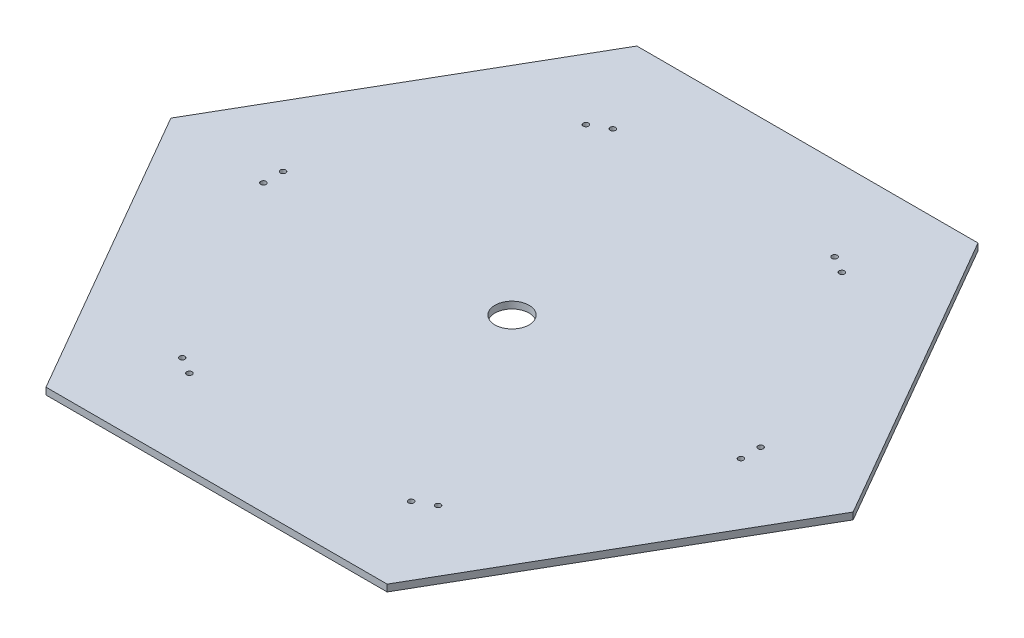
ISO-10303-21;
HEADER;
FILE_DESCRIPTION(('STEP AP214'),'2;1');
FILE_NAME('part.step','',(''),(''),'','','');
FILE_SCHEMA(('AUTOMOTIVE_DESIGN { 1 0 10303 214 1 1 1 1 }'));
ENDSEC;
DATA;
#1=APPLICATION_CONTEXT('core data for automotive mechanical design processes');
#2=APPLICATION_PROTOCOL_DEFINITION('international standard','automotive_design',2000,#1);
#3=PRODUCT_CONTEXT('',#1,'mechanical');
#4=PRODUCT('Part','Part','',(#3));
#5=PRODUCT_RELATED_PRODUCT_CATEGORY('part','',(#4));
#6=PRODUCT_DEFINITION_FORMATION('','',#4);
#7=PRODUCT_DEFINITION_CONTEXT('part definition',#1,'design');
#8=PRODUCT_DEFINITION('design','',#6,#7);
#9=PRODUCT_DEFINITION_SHAPE('','',#8);
#10=(LENGTH_UNIT() NAMED_UNIT(*) SI_UNIT(.MILLI.,.METRE.));
#11=(NAMED_UNIT(*) PLANE_ANGLE_UNIT() SI_UNIT($,.RADIAN.));
#12=(NAMED_UNIT(*) SI_UNIT($,.STERADIAN.) SOLID_ANGLE_UNIT());
#13=UNCERTAINTY_MEASURE_WITH_UNIT(LENGTH_MEASURE(1.E-05),#10,'distance_accuracy_value','');
#14=(GEOMETRIC_REPRESENTATION_CONTEXT(3) GLOBAL_UNCERTAINTY_ASSIGNED_CONTEXT((#13)) GLOBAL_UNIT_ASSIGNED_CONTEXT((#10,
#11,#12)) REPRESENTATION_CONTEXT('',''));
#15=CARTESIAN_POINT('',(0.,0.,0.));
#16=DIRECTION('',(0.,0.,1.));
#17=DIRECTION('',(1.,0.,0.));
#18=AXIS2_PLACEMENT_3D('',#15,#16,#17);
#19=CARTESIAN_POINT('',(349.999999999999,10.,14.46));
#20=DIRECTION('',(0.,-1.,0.));
#21=DIRECTION('',(-0.866025403784433,0.,-0.50000000000001));
#22=AXIS2_PLACEMENT_3D('',#19,#20,#21);
#23=CYLINDRICAL_SURFACE('',#22,3.96875);
#24=CARTESIAN_POINT('',(349.999999999999,10.,14.46));
#25=DIRECTION('',(0.,-1.,0.));
#26=DIRECTION('',(-0.866025403784433,0.,-0.50000000000001));
#27=AXIS2_PLACEMENT_3D('',#24,#25,#26);
#28=CIRCLE('',#27,3.96875);
#29=CARTESIAN_POINT('',(346.56296167873,10.,12.475625));
#30=VERTEX_POINT('',#29);
#31=EDGE_CURVE('E40',#30,#30,#28,.T.);
#32=ORIENTED_EDGE('',*,*,#31,.F.);
#33=EDGE_LOOP('',(#32));
#34=FACE_BOUND('',#33,.T.);
#35=CARTESIAN_POINT('',(349.999999999999,0.,14.46));
#36=DIRECTION('',(0.,-1.,0.));
#37=DIRECTION('',(-0.866025403784433,0.,-0.50000000000001));
#38=AXIS2_PLACEMENT_3D('',#35,#36,#37);
#39=CIRCLE('',#38,3.96875);
#40=CARTESIAN_POINT('',(346.56296167873,0.,12.475625));
#41=VERTEX_POINT('',#40);
#42=EDGE_CURVE('E11',#41,#41,#39,.T.);
#43=ORIENTED_EDGE('',*,*,#42,.T.);
#44=EDGE_LOOP('',(#43));
#45=FACE_BOUND('',#44,.T.);
#46=ADVANCED_FACE('F32',(#34,#45),#23,.F.);
#47=CARTESIAN_POINT('',(349.999999999999,10.,-14.46));
#48=DIRECTION('',(0.,-1.,0.));
#49=DIRECTION('',(-0.866025403784433,0.,-0.50000000000001));
#50=AXIS2_PLACEMENT_3D('',#47,#48,#49);
#51=CYLINDRICAL_SURFACE('',#50,3.96875);
#52=CARTESIAN_POINT('',(349.999999999999,10.,-14.46));
#53=DIRECTION('',(0.,-1.,0.));
#54=DIRECTION('',(-0.866025403784433,0.,-0.50000000000001));
#55=AXIS2_PLACEMENT_3D('',#52,#53,#54);
#56=CIRCLE('',#55,3.96875);
#57=CARTESIAN_POINT('',(346.56296167873,10.,-16.444375));
#58=VERTEX_POINT('',#57);
#59=EDGE_CURVE('E185',#58,#58,#56,.T.);
#60=ORIENTED_EDGE('',*,*,#59,.F.);
#61=EDGE_LOOP('',(#60));
#62=FACE_BOUND('',#61,.T.);
#63=CARTESIAN_POINT('',(349.999999999999,0.,-14.46));
#64=DIRECTION('',(0.,-1.,0.));
#65=DIRECTION('',(-0.866025403784433,0.,-0.50000000000001));
#66=AXIS2_PLACEMENT_3D('',#63,#64,#65);
#67=CIRCLE('',#66,3.96875);
#68=CARTESIAN_POINT('',(346.56296167873,0.,-16.444375));
#69=VERTEX_POINT('',#68);
#70=EDGE_CURVE('E188',#69,#69,#67,.T.);
#71=ORIENTED_EDGE('',*,*,#70,.T.);
#72=EDGE_LOOP('',(#71));
#73=FACE_BOUND('',#72,.T.);
#74=ADVANCED_FACE('F197',(#62,#73),#51,.F.);
#75=CARTESIAN_POINT('',(187.522727338722,10.,-295.878891324553));
#76=DIRECTION('',(0.,-1.,0.));
#77=DIRECTION('',(-0.866025403784443,0.,0.499999999999992));
#78=AXIS2_PLACEMENT_3D('',#75,#76,#77);
#79=CYLINDRICAL_SURFACE('',#78,3.96875);
#80=CARTESIAN_POINT('',(187.522727338722,10.,-295.878891324553));
#81=DIRECTION('',(0.,-1.,0.));
#82=DIRECTION('',(-0.866025403784443,0.,0.499999999999992));
#83=AXIS2_PLACEMENT_3D('',#80,#81,#82);
#84=CIRCLE('',#83,3.96875);
#85=CARTESIAN_POINT('',(184.085689017452,10.,-293.894516324553));
#86=VERTEX_POINT('',#85);
#87=EDGE_CURVE('E179',#86,#86,#84,.T.);
#88=ORIENTED_EDGE('',*,*,#87,.F.);
#89=EDGE_LOOP('',(#88));
#90=FACE_BOUND('',#89,.T.);
#91=CARTESIAN_POINT('',(187.522727338722,0.,-295.878891324553));
#92=DIRECTION('',(0.,-1.,0.));
#93=DIRECTION('',(-0.866025403784443,0.,0.499999999999992));
#94=AXIS2_PLACEMENT_3D('',#91,#92,#93);
#95=CIRCLE('',#94,3.96875);
#96=CARTESIAN_POINT('',(184.085689017452,0.,-293.894516324553));
#97=VERTEX_POINT('',#96);
#98=EDGE_CURVE('E182',#97,#97,#95,.T.);
#99=ORIENTED_EDGE('',*,*,#98,.T.);
#100=EDGE_LOOP('',(#99));
#101=FACE_BOUND('',#100,.T.);
#102=ADVANCED_FACE('F289',(#90,#101),#79,.F.);
#103=CARTESIAN_POINT('',(162.477272661276,10.,-310.338891324553));
#104=DIRECTION('',(0.,-1.,0.));
#105=DIRECTION('',(-0.866025403784443,0.,0.499999999999992));
#106=AXIS2_PLACEMENT_3D('',#103,#104,#105);
#107=CYLINDRICAL_SURFACE('',#106,3.96875);
#108=CARTESIAN_POINT('',(162.477272661276,10.,-310.338891324553));
#109=DIRECTION('',(0.,-1.,0.));
#110=DIRECTION('',(-0.866025403784443,0.,0.499999999999992));
#111=AXIS2_PLACEMENT_3D('',#108,#109,#110);
#112=CIRCLE('',#111,3.96875);
#113=CARTESIAN_POINT('',(159.040234340006,10.,-308.354516324553));
#114=VERTEX_POINT('',#113);
#115=EDGE_CURVE('E173',#114,#114,#112,.T.);
#116=ORIENTED_EDGE('',*,*,#115,.F.);
#117=EDGE_LOOP('',(#116));
#118=FACE_BOUND('',#117,.T.);
#119=CARTESIAN_POINT('',(162.477272661276,0.,-310.338891324553));
#120=DIRECTION('',(0.,-1.,0.));
#121=DIRECTION('',(-0.866025403784443,0.,0.499999999999992));
#122=AXIS2_PLACEMENT_3D('',#119,#120,#121);
#123=CIRCLE('',#122,3.96875);
#124=CARTESIAN_POINT('',(159.040234340006,0.,-308.354516324553));
#125=VERTEX_POINT('',#124);
#126=EDGE_CURVE('E176',#125,#125,#123,.T.);
#127=ORIENTED_EDGE('',*,*,#126,.T.);
#128=EDGE_LOOP('',(#127));
#129=FACE_BOUND('',#128,.T.);
#130=ADVANCED_FACE('F285',(#118,#129),#107,.F.);
#131=CARTESIAN_POINT('',(-162.47727266128,10.,-310.338891324551));
#132=DIRECTION('',(0.,-1.,0.));
#133=DIRECTION('',(0.,0.,1.));
#134=AXIS2_PLACEMENT_3D('',#131,#132,#133);
#135=CYLINDRICAL_SURFACE('',#134,3.96875);
#136=CARTESIAN_POINT('',(-162.47727266128,10.,-310.338891324551));
#137=DIRECTION('',(0.,-1.,0.));
#138=DIRECTION('',(0.,0.,1.));
#139=AXIS2_PLACEMENT_3D('',#136,#137,#138);
#140=CIRCLE('',#139,3.96875);
#141=CARTESIAN_POINT('',(-162.47727266128,10.,-306.370141324551));
#142=VERTEX_POINT('',#141);
#143=EDGE_CURVE('E167',#142,#142,#140,.T.);
#144=ORIENTED_EDGE('',*,*,#143,.F.);
#145=EDGE_LOOP('',(#144));
#146=FACE_BOUND('',#145,.T.);
#147=CARTESIAN_POINT('',(-162.47727266128,0.,-310.338891324551));
#148=DIRECTION('',(0.,-1.,0.));
#149=DIRECTION('',(0.,0.,1.));
#150=AXIS2_PLACEMENT_3D('',#147,#148,#149);
#151=CIRCLE('',#150,3.96875);
#152=CARTESIAN_POINT('',(-162.47727266128,0.,-306.370141324551));
#153=VERTEX_POINT('',#152);
#154=EDGE_CURVE('E170',#153,#153,#151,.T.);
#155=ORIENTED_EDGE('',*,*,#154,.T.);
#156=EDGE_LOOP('',(#155));
#157=FACE_BOUND('',#156,.T.);
#158=ADVANCED_FACE('F281',(#146,#157),#135,.F.);
#159=CARTESIAN_POINT('',(-187.522727338726,10.,-295.878891324551));
#160=DIRECTION('',(0.,-1.,0.));
#161=DIRECTION('',(0.,0.,1.));
#162=AXIS2_PLACEMENT_3D('',#159,#160,#161);
#163=CYLINDRICAL_SURFACE('',#162,3.96875);
#164=CARTESIAN_POINT('',(-187.522727338726,10.,-295.878891324551));
#165=DIRECTION('',(0.,-1.,0.));
#166=DIRECTION('',(0.,0.,1.));
#167=AXIS2_PLACEMENT_3D('',#164,#165,#166);
#168=CIRCLE('',#167,3.96875);
#169=CARTESIAN_POINT('',(-187.522727338726,10.,-291.910141324551));
#170=VERTEX_POINT('',#169);
#171=EDGE_CURVE('E161',#170,#170,#168,.T.);
#172=ORIENTED_EDGE('',*,*,#171,.F.);
#173=EDGE_LOOP('',(#172));
#174=FACE_BOUND('',#173,.T.);
#175=CARTESIAN_POINT('',(-187.522727338726,0.,-295.878891324551));
#176=DIRECTION('',(0.,-1.,0.));
#177=DIRECTION('',(0.,0.,1.));
#178=AXIS2_PLACEMENT_3D('',#175,#176,#177);
#179=CIRCLE('',#178,3.96875);
#180=CARTESIAN_POINT('',(-187.522727338726,0.,-291.910141324551));
#181=VERTEX_POINT('',#180);
#182=EDGE_CURVE('E164',#181,#181,#179,.T.);
#183=ORIENTED_EDGE('',*,*,#182,.T.);
#184=EDGE_LOOP('',(#183));
#185=FACE_BOUND('',#184,.T.);
#186=ADVANCED_FACE('F277',(#174,#185),#163,.F.);
#187=CARTESIAN_POINT('',(-349.999999999999,10.,-14.4599999999976));
#188=DIRECTION('',(0.,-1.,0.));
#189=DIRECTION('',(0.866025403784436,0.,0.500000000000004));
#190=AXIS2_PLACEMENT_3D('',#187,#188,#189);
#191=CYLINDRICAL_SURFACE('',#190,3.96875);
#192=CARTESIAN_POINT('',(-349.999999999999,10.,-14.4599999999976));
#193=DIRECTION('',(0.,-1.,0.));
#194=DIRECTION('',(0.866025403784436,0.,0.500000000000004));
#195=AXIS2_PLACEMENT_3D('',#192,#193,#194);
#196=CIRCLE('',#195,3.96875);
#197=CARTESIAN_POINT('',(-346.56296167873,10.,-12.4756249999975));
#198=VERTEX_POINT('',#197);
#199=EDGE_CURVE('E155',#198,#198,#196,.T.);
#200=ORIENTED_EDGE('',*,*,#199,.F.);
#201=EDGE_LOOP('',(#200));
#202=FACE_BOUND('',#201,.T.);
#203=CARTESIAN_POINT('',(-349.999999999999,0.,-14.4599999999976));
#204=DIRECTION('',(0.,-1.,0.));
#205=DIRECTION('',(0.866025403784436,0.,0.500000000000004));
#206=AXIS2_PLACEMENT_3D('',#203,#204,#205);
#207=CIRCLE('',#206,3.96875);
#208=CARTESIAN_POINT('',(-346.56296167873,0.,-12.4756249999975));
#209=VERTEX_POINT('',#208);
#210=EDGE_CURVE('E158',#209,#209,#207,.T.);
#211=ORIENTED_EDGE('',*,*,#210,.T.);
#212=EDGE_LOOP('',(#211));
#213=FACE_BOUND('',#212,.T.);
#214=ADVANCED_FACE('F273',(#202,#213),#191,.F.);
#215=CARTESIAN_POINT('',(-349.999999999999,10.,14.4600000000024));
#216=DIRECTION('',(0.,-1.,0.));
#217=DIRECTION('',(0.866025403784436,0.,0.500000000000004));
#218=AXIS2_PLACEMENT_3D('',#215,#216,#217);
#219=CYLINDRICAL_SURFACE('',#218,3.96875);
#220=CARTESIAN_POINT('',(-349.999999999999,10.,14.4600000000024));
#221=DIRECTION('',(0.,-1.,0.));
#222=DIRECTION('',(0.866025403784436,0.,0.500000000000004));
#223=AXIS2_PLACEMENT_3D('',#220,#221,#222);
#224=CIRCLE('',#223,3.96875);
#225=CARTESIAN_POINT('',(-346.562961678729,10.,16.4443750000025));
#226=VERTEX_POINT('',#225);
#227=EDGE_CURVE('E149',#226,#226,#224,.T.);
#228=ORIENTED_EDGE('',*,*,#227,.F.);
#229=EDGE_LOOP('',(#228));
#230=FACE_BOUND('',#229,.T.);
#231=CARTESIAN_POINT('',(-349.999999999999,0.,14.4600000000024));
#232=DIRECTION('',(0.,-1.,0.));
#233=DIRECTION('',(0.866025403784436,0.,0.500000000000004));
#234=AXIS2_PLACEMENT_3D('',#231,#232,#233);
#235=CIRCLE('',#234,3.96875);
#236=CARTESIAN_POINT('',(-346.562961678729,0.,16.4443750000025));
#237=VERTEX_POINT('',#236);
#238=EDGE_CURVE('E152',#237,#237,#235,.T.);
#239=ORIENTED_EDGE('',*,*,#238,.T.);
#240=EDGE_LOOP('',(#239));
#241=FACE_BOUND('',#240,.T.);
#242=ADVANCED_FACE('F269',(#230,#241),#219,.F.);
#243=CARTESIAN_POINT('',(-187.52272733872,10.,295.878891324554));
#244=DIRECTION('',(0.,-1.,0.));
#245=DIRECTION('',(0.86602540378444,0.,-0.499999999999998));
#246=AXIS2_PLACEMENT_3D('',#243,#244,#245);
#247=CYLINDRICAL_SURFACE('',#246,3.96875);
#248=CARTESIAN_POINT('',(-187.52272733872,10.,295.878891324554));
#249=DIRECTION('',(0.,-1.,0.));
#250=DIRECTION('',(0.86602540378444,0.,-0.499999999999998));
#251=AXIS2_PLACEMENT_3D('',#248,#249,#250);
#252=CIRCLE('',#251,3.96875);
#253=CARTESIAN_POINT('',(-184.08568901745,10.,293.894516324555));
#254=VERTEX_POINT('',#253);
#255=EDGE_CURVE('E143',#254,#254,#252,.T.);
#256=ORIENTED_EDGE('',*,*,#255,.F.);
#257=EDGE_LOOP('',(#256));
#258=FACE_BOUND('',#257,.T.);
#259=CARTESIAN_POINT('',(-187.52272733872,0.,295.878891324554));
#260=DIRECTION('',(0.,-1.,0.));
#261=DIRECTION('',(0.86602540378444,0.,-0.499999999999998));
#262=AXIS2_PLACEMENT_3D('',#259,#260,#261);
#263=CIRCLE('',#262,3.96875);
#264=CARTESIAN_POINT('',(-184.08568901745,0.,293.894516324555));
#265=VERTEX_POINT('',#264);
#266=EDGE_CURVE('E146',#265,#265,#263,.T.);
#267=ORIENTED_EDGE('',*,*,#266,.T.);
#268=EDGE_LOOP('',(#267));
#269=FACE_BOUND('',#268,.T.);
#270=ADVANCED_FACE('F265',(#258,#269),#247,.F.);
#271=CARTESIAN_POINT('',(-162.477272661274,10.,310.338891324554));
#272=DIRECTION('',(0.,-1.,0.));
#273=DIRECTION('',(0.86602540378444,0.,-0.499999999999998));
#274=AXIS2_PLACEMENT_3D('',#271,#272,#273);
#275=CYLINDRICAL_SURFACE('',#274,3.96875);
#276=CARTESIAN_POINT('',(-162.477272661274,10.,310.338891324554));
#277=DIRECTION('',(0.,-1.,0.));
#278=DIRECTION('',(0.86602540378444,0.,-0.499999999999998));
#279=AXIS2_PLACEMENT_3D('',#276,#277,#278);
#280=CIRCLE('',#279,3.96875);
#281=CARTESIAN_POINT('',(-159.040234340004,10.,308.354516324554));
#282=VERTEX_POINT('',#281);
#283=EDGE_CURVE('E137',#282,#282,#280,.T.);
#284=ORIENTED_EDGE('',*,*,#283,.F.);
#285=EDGE_LOOP('',(#284));
#286=FACE_BOUND('',#285,.T.);
#287=CARTESIAN_POINT('',(-162.477272661274,0.,310.338891324554));
#288=DIRECTION('',(0.,-1.,0.));
#289=DIRECTION('',(0.86602540378444,0.,-0.499999999999998));
#290=AXIS2_PLACEMENT_3D('',#287,#288,#289);
#291=CIRCLE('',#290,3.96875);
#292=CARTESIAN_POINT('',(-159.040234340004,0.,308.354516324554));
#293=VERTEX_POINT('',#292);
#294=EDGE_CURVE('E140',#293,#293,#291,.T.);
#295=ORIENTED_EDGE('',*,*,#294,.T.);
#296=EDGE_LOOP('',(#295));
#297=FACE_BOUND('',#296,.T.);
#298=ADVANCED_FACE('F262',(#286,#297),#275,.F.);
#299=CARTESIAN_POINT('',(250.000000000005,10.,433.012701892216));
#300=DIRECTION('',(-0.866025403784442,0.,-0.499999999999995));
#301=DIRECTION('',(-0.499999999999995,0.,0.866025403784442));
#302=AXIS2_PLACEMENT_3D('',#299,#300,#301);
#303=PLANE('',#302);
#304=DIRECTION('',(0.499999999999995,0.,-0.866025403784442));
#305=VECTOR('',#304,1.);
#306=CARTESIAN_POINT('',(250.000000000005,0.,433.012701892216));
#307=LINE('',#306,#305);
#308=CARTESIAN_POINT('',(250.000000000005,0.,433.012701892216));
#309=VERTEX_POINT('',#308);
#310=CARTESIAN_POINT('',(499.999999999999,0.,0.));
#311=VERTEX_POINT('',#310);
#312=EDGE_CURVE('E117',#309,#311,#307,.T.);
#313=ORIENTED_EDGE('',*,*,#312,.T.);
#314=DIRECTION('',(0.,-1.,0.));
#315=VECTOR('',#314,1.);
#316=CARTESIAN_POINT('',(499.999999999999,10.,0.));
#317=LINE('',#316,#315);
#318=CARTESIAN_POINT('',(499.999999999999,10.,0.));
#319=VERTEX_POINT('',#318);
#320=EDGE_CURVE('E135',#319,#311,#317,.T.);
#321=ORIENTED_EDGE('',*,*,#320,.F.);
#322=DIRECTION('',(0.499999999999995,0.,-0.866025403784442));
#323=VECTOR('',#322,1.);
#324=CARTESIAN_POINT('',(250.000000000005,10.,433.012701892216));
#325=LINE('',#324,#323);
#326=CARTESIAN_POINT('',(250.000000000005,10.,433.012701892216));
#327=VERTEX_POINT('',#326);
#328=EDGE_CURVE('E128',#327,#319,#325,.T.);
#329=ORIENTED_EDGE('',*,*,#328,.F.);
#330=DIRECTION('',(0.,-1.,0.));
#331=VECTOR('',#330,1.);
#332=CARTESIAN_POINT('',(250.000000000005,10.,433.012701892216));
#333=LINE('',#332,#331);
#334=EDGE_CURVE('E113',#327,#309,#333,.T.);
#335=ORIENTED_EDGE('',*,*,#334,.T.);
#336=EDGE_LOOP('',(#313,#321,#329,#335));
#337=FACE_BOUND('',#336,.T.);
#338=ADVANCED_FACE('F238',(#337),#303,.F.);
#339=CARTESIAN_POINT('',(499.999999999999,10.,0.));
#340=DIRECTION('',(-0.866025403784438,0.,0.500000000000001));
#341=DIRECTION('',(0.500000000000001,0.,0.866025403784438));
#342=AXIS2_PLACEMENT_3D('',#339,#340,#341);
#343=PLANE('',#342);
#344=DIRECTION('',(-0.500000000000001,0.,-0.866025403784438));
#345=VECTOR('',#344,1.);
#346=CARTESIAN_POINT('',(499.999999999999,0.,0.));
#347=LINE('',#346,#345);
#348=CARTESIAN_POINT('',(249.999999999999,0.,-433.012701892219));
#349=VERTEX_POINT('',#348);
#350=EDGE_CURVE('E120',#311,#349,#347,.T.);
#351=ORIENTED_EDGE('',*,*,#350,.T.);
#352=DIRECTION('',(0.,-1.,0.));
#353=VECTOR('',#352,1.);
#354=CARTESIAN_POINT('',(249.999999999999,10.,-433.012701892219));
#355=LINE('',#354,#353);
#356=CARTESIAN_POINT('',(249.999999999999,10.,-433.012701892219));
#357=VERTEX_POINT('',#356);
#358=EDGE_CURVE('E132',#357,#349,#355,.T.);
#359=ORIENTED_EDGE('',*,*,#358,.F.);
#360=DIRECTION('',(-0.500000000000001,0.,-0.866025403784438));
#361=VECTOR('',#360,1.);
#362=CARTESIAN_POINT('',(499.999999999999,10.,0.));
#363=LINE('',#362,#361);
#364=EDGE_CURVE('E86',#319,#357,#363,.T.);
#365=ORIENTED_EDGE('',*,*,#364,.F.);
#366=ORIENTED_EDGE('',*,*,#320,.T.);
#367=EDGE_LOOP('',(#351,#359,#365,#366));
#368=FACE_BOUND('',#367,.T.);
#369=ADVANCED_FACE('F256',(#368),#343,.F.);
#370=CARTESIAN_POINT('',(249.999999999999,10.,-433.012701892219));
#371=DIRECTION('',(0.,0.,1.));
#372=DIRECTION('',(1.,0.,0.));
#373=AXIS2_PLACEMENT_3D('',#370,#371,#372);
#374=PLANE('',#373);
#375=DIRECTION('',(-1.,0.,0.));
#376=VECTOR('',#375,1.);
#377=CARTESIAN_POINT('',(249.999999999999,0.,-433.012701892219));
#378=LINE('',#377,#376);
#379=CARTESIAN_POINT('',(-250.000000000002,0.,-433.012701892217));
#380=VERTEX_POINT('',#379);
#381=EDGE_CURVE('E123',#349,#380,#378,.T.);
#382=ORIENTED_EDGE('',*,*,#381,.T.);
#383=DIRECTION('',(0.,-1.,0.));
#384=VECTOR('',#383,1.);
#385=CARTESIAN_POINT('',(-250.000000000002,10.,-433.012701892217));
#386=LINE('',#385,#384);
#387=CARTESIAN_POINT('',(-250.000000000002,10.,-433.012701892217));
#388=VERTEX_POINT('',#387);
#389=EDGE_CURVE('E108',#388,#380,#386,.T.);
#390=ORIENTED_EDGE('',*,*,#389,.F.);
#391=DIRECTION('',(-1.,0.,0.));
#392=VECTOR('',#391,1.);
#393=CARTESIAN_POINT('',(249.999999999999,10.,-433.012701892219));
#394=LINE('',#393,#392);
#395=EDGE_CURVE('E99',#357,#388,#394,.T.);
#396=ORIENTED_EDGE('',*,*,#395,.F.);
#397=ORIENTED_EDGE('',*,*,#358,.T.);
#398=EDGE_LOOP('',(#382,#390,#396,#397));
#399=FACE_BOUND('',#398,.T.);
#400=ADVANCED_FACE('F253',(#399),#374,.F.);
#401=CARTESIAN_POINT('',(-250.000000000002,10.,-433.012701892217));
#402=DIRECTION('',(0.866025403784442,0.,0.499999999999995));
#403=DIRECTION('',(0.499999999999995,0.,-0.866025403784442));
#404=AXIS2_PLACEMENT_3D('',#401,#402,#403);
#405=PLANE('',#404);
#406=DIRECTION('',(-0.499999999999995,0.,0.866025403784442));
#407=VECTOR('',#406,1.);
#408=CARTESIAN_POINT('',(-250.000000000002,0.,-433.012701892217));
#409=LINE('',#408,#407);
#410=CARTESIAN_POINT('',(-499.999999999999,0.,3.49148133884313E-12));
#411=VERTEX_POINT('',#410);
#412=EDGE_CURVE('E107',#380,#411,#409,.T.);
#413=ORIENTED_EDGE('',*,*,#412,.T.);
#414=DIRECTION('',(0.,-1.,0.));
#415=VECTOR('',#414,1.);
#416=CARTESIAN_POINT('',(-499.999999999999,10.,3.49148133884313E-12));
#417=LINE('',#416,#415);
#418=CARTESIAN_POINT('',(-499.999999999999,10.,3.49148133884313E-12));
#419=VERTEX_POINT('',#418);
#420=EDGE_CURVE('E104',#419,#411,#417,.T.);
#421=ORIENTED_EDGE('',*,*,#420,.F.);
#422=DIRECTION('',(-0.499999999999995,0.,0.866025403784442));
#423=VECTOR('',#422,1.);
#424=CARTESIAN_POINT('',(-250.000000000002,10.,-433.012701892217));
#425=LINE('',#424,#423);
#426=EDGE_CURVE('E93',#388,#419,#425,.T.);
#427=ORIENTED_EDGE('',*,*,#426,.F.);
#428=ORIENTED_EDGE('',*,*,#389,.T.);
#429=EDGE_LOOP('',(#413,#421,#427,#428));
#430=FACE_BOUND('',#429,.T.);
#431=ADVANCED_FACE('F105',(#430),#405,.F.);
#432=CARTESIAN_POINT('',(-499.999999999999,10.,3.49148133884313E-12));
#433=DIRECTION('',(0.866025403784435,0.,-0.500000000000007));
#434=DIRECTION('',(-0.500000000000007,0.,-0.866025403784435));
#435=AXIS2_PLACEMENT_3D('',#432,#433,#434);
#436=PLANE('',#435);
#437=DIRECTION('',(0.500000000000007,0.,0.866025403784435));
#438=VECTOR('',#437,1.);
#439=CARTESIAN_POINT('',(-499.999999999999,0.,3.49148133884313E-12));
#440=LINE('',#439,#438);
#441=CARTESIAN_POINT('',(-249.999999999996,0.,433.012701892221));
#442=VERTEX_POINT('',#441);
#443=EDGE_CURVE('E71',#411,#442,#440,.T.);
#444=ORIENTED_EDGE('',*,*,#443,.T.);
#445=DIRECTION('',(0.,-1.,0.));
#446=VECTOR('',#445,1.);
#447=CARTESIAN_POINT('',(-249.999999999996,10.,433.012701892221));
#448=LINE('',#447,#446);
#449=CARTESIAN_POINT('',(-249.999999999996,10.,433.012701892221));
#450=VERTEX_POINT('',#449);
#451=EDGE_CURVE('E109',#450,#442,#448,.T.);
#452=ORIENTED_EDGE('',*,*,#451,.F.);
#453=DIRECTION('',(0.500000000000007,0.,0.866025403784435));
#454=VECTOR('',#453,1.);
#455=CARTESIAN_POINT('',(-499.999999999999,10.,3.49148133884313E-12));
#456=LINE('',#455,#454);
#457=EDGE_CURVE('E97',#419,#450,#456,.T.);
#458=ORIENTED_EDGE('',*,*,#457,.F.);
#459=ORIENTED_EDGE('',*,*,#420,.T.);
#460=EDGE_LOOP('',(#444,#452,#458,#459));
#461=FACE_BOUND('',#460,.T.);
#462=ADVANCED_FACE('F111',(#461),#436,.F.);
#463=CARTESIAN_POINT('',(-249.999999999996,10.,433.012701892221));
#464=DIRECTION('',(0.,0.,-1.));
#465=DIRECTION('',(-1.,0.,0.));
#466=AXIS2_PLACEMENT_3D('',#463,#464,#465);
#467=PLANE('',#466);
#468=DIRECTION('',(1.,0.,0.));
#469=VECTOR('',#468,1.);
#470=CARTESIAN_POINT('',(-249.999999999996,0.,433.012701892221));
#471=LINE('',#470,#469);
#472=EDGE_CURVE('E77',#442,#309,#471,.T.);
#473=ORIENTED_EDGE('',*,*,#472,.T.);
#474=ORIENTED_EDGE('',*,*,#334,.F.);
#475=DIRECTION('',(1.,0.,0.));
#476=VECTOR('',#475,1.);
#477=CARTESIAN_POINT('',(-249.999999999996,10.,433.012701892221));
#478=LINE('',#477,#476);
#479=EDGE_CURVE('E48',#450,#327,#478,.T.);
#480=ORIENTED_EDGE('',*,*,#479,.F.);
#481=ORIENTED_EDGE('',*,*,#451,.T.);
#482=EDGE_LOOP('',(#473,#474,#480,#481));
#483=FACE_BOUND('',#482,.T.);
#484=ADVANCED_FACE('F240',(#483),#467,.F.);
#485=CARTESIAN_POINT('',(0.,10.,0.));
#486=DIRECTION('',(0.,1.,0.));
#487=DIRECTION('',(0.,0.,1.));
#488=AXIS2_PLACEMENT_3D('',#485,#486,#487);
#489=PLANE('',#488);
#490=ORIENTED_EDGE('',*,*,#59,.T.);
#491=EDGE_LOOP('',(#490));
#492=FACE_BOUND('',#491,.T.);
#493=ORIENTED_EDGE('',*,*,#31,.T.);
#494=EDGE_LOOP('',(#493));
#495=FACE_BOUND('',#494,.T.);
#496=ORIENTED_EDGE('',*,*,#115,.T.);
#497=EDGE_LOOP('',(#496));
#498=FACE_BOUND('',#497,.T.);
#499=ORIENTED_EDGE('',*,*,#87,.T.);
#500=EDGE_LOOP('',(#499));
#501=FACE_BOUND('',#500,.T.);
#502=ORIENTED_EDGE('',*,*,#171,.T.);
#503=EDGE_LOOP('',(#502));
#504=FACE_BOUND('',#503,.T.);
#505=ORIENTED_EDGE('',*,*,#143,.T.);
#506=EDGE_LOOP('',(#505));
#507=FACE_BOUND('',#506,.T.);
#508=ORIENTED_EDGE('',*,*,#227,.T.);
#509=EDGE_LOOP('',(#508));
#510=FACE_BOUND('',#509,.T.);
#511=ORIENTED_EDGE('',*,*,#199,.T.);
#512=EDGE_LOOP('',(#511));
#513=FACE_BOUND('',#512,.T.);
#514=ORIENTED_EDGE('',*,*,#283,.T.);
#515=EDGE_LOOP('',(#514));
#516=FACE_BOUND('',#515,.T.);
#517=ORIENTED_EDGE('',*,*,#255,.T.);
#518=EDGE_LOOP('',(#517));
#519=FACE_BOUND('',#518,.T.);
#520=CARTESIAN_POINT('',(0.,10.,0.));
#521=DIRECTION('',(0.,-1.,0.));
#522=DIRECTION('',(0.,0.,-1.));
#523=AXIS2_PLACEMENT_3D('',#520,#521,#522);
#524=CIRCLE('',#523,25.);
#525=CARTESIAN_POINT('',(0.,10.,-25.));
#526=VERTEX_POINT('',#525);
#527=EDGE_CURVE('E419',#526,#526,#524,.T.);
#528=ORIENTED_EDGE('',*,*,#527,.T.);
#529=EDGE_LOOP('',(#528));
#530=FACE_BOUND('',#529,.T.);
#531=CARTESIAN_POINT('',(162.47727266128,10.,310.338891324551));
#532=DIRECTION('',(0.,-1.,0.));
#533=DIRECTION('',(0.,0.,-1.));
#534=AXIS2_PLACEMENT_3D('',#531,#532,#533);
#535=CIRCLE('',#534,3.96875);
#536=CARTESIAN_POINT('',(162.47727266128,10.,306.370141324551));
#537=VERTEX_POINT('',#536);
#538=EDGE_CURVE('E121',#537,#537,#535,.T.);
#539=ORIENTED_EDGE('',*,*,#538,.T.);
#540=EDGE_LOOP('',(#539));
#541=FACE_BOUND('',#540,.T.);
#542=CARTESIAN_POINT('',(187.522727338726,10.,295.878891324551));
#543=DIRECTION('',(0.,-1.,0.));
#544=DIRECTION('',(0.,0.,-1.));
#545=AXIS2_PLACEMENT_3D('',#542,#543,#544);
#546=CIRCLE('',#545,3.96875);
#547=CARTESIAN_POINT('',(187.522727338726,10.,291.910141324551));
#548=VERTEX_POINT('',#547);
#549=EDGE_CURVE('E426',#548,#548,#546,.T.);
#550=ORIENTED_EDGE('',*,*,#549,.T.);
#551=EDGE_LOOP('',(#550));
#552=FACE_BOUND('',#551,.T.);
#553=ORIENTED_EDGE('',*,*,#328,.T.);
#554=ORIENTED_EDGE('',*,*,#364,.T.);
#555=ORIENTED_EDGE('',*,*,#395,.T.);
#556=ORIENTED_EDGE('',*,*,#426,.T.);
#557=ORIENTED_EDGE('',*,*,#457,.T.);
#558=ORIENTED_EDGE('',*,*,#479,.T.);
#559=EDGE_LOOP('',(#553,#554,#555,#556,#557,#558));
#560=FACE_BOUND('',#559,.T.);
#561=ADVANCED_FACE('F95',(#492,#495,#498,#501,#504,#507,#510,#513,#516,#519,#530,#541,#552,
#560),#489,.T.);
#562=CARTESIAN_POINT('',(0.,0.,0.));
#563=DIRECTION('',(0.,1.,0.));
#564=DIRECTION('',(0.,0.,1.));
#565=AXIS2_PLACEMENT_3D('',#562,#563,#564);
#566=PLANE('',#565);
#567=ORIENTED_EDGE('',*,*,#70,.F.);
#568=EDGE_LOOP('',(#567));
#569=FACE_BOUND('',#568,.T.);
#570=ORIENTED_EDGE('',*,*,#42,.F.);
#571=EDGE_LOOP('',(#570));
#572=FACE_BOUND('',#571,.T.);
#573=ORIENTED_EDGE('',*,*,#126,.F.);
#574=EDGE_LOOP('',(#573));
#575=FACE_BOUND('',#574,.T.);
#576=ORIENTED_EDGE('',*,*,#98,.F.);
#577=EDGE_LOOP('',(#576));
#578=FACE_BOUND('',#577,.T.);
#579=ORIENTED_EDGE('',*,*,#182,.F.);
#580=EDGE_LOOP('',(#579));
#581=FACE_BOUND('',#580,.T.);
#582=ORIENTED_EDGE('',*,*,#154,.F.);
#583=EDGE_LOOP('',(#582));
#584=FACE_BOUND('',#583,.T.);
#585=ORIENTED_EDGE('',*,*,#238,.F.);
#586=EDGE_LOOP('',(#585));
#587=FACE_BOUND('',#586,.T.);
#588=ORIENTED_EDGE('',*,*,#210,.F.);
#589=EDGE_LOOP('',(#588));
#590=FACE_BOUND('',#589,.T.);
#591=ORIENTED_EDGE('',*,*,#294,.F.);
#592=EDGE_LOOP('',(#591));
#593=FACE_BOUND('',#592,.T.);
#594=ORIENTED_EDGE('',*,*,#266,.F.);
#595=EDGE_LOOP('',(#594));
#596=FACE_BOUND('',#595,.T.);
#597=CARTESIAN_POINT('',(0.,0.,0.));
#598=DIRECTION('',(0.,-1.,0.));
#599=DIRECTION('',(0.,0.,-1.));
#600=AXIS2_PLACEMENT_3D('',#597,#598,#599);
#601=CIRCLE('',#600,25.);
#602=CARTESIAN_POINT('',(0.,0.,-25.));
#603=VERTEX_POINT('',#602);
#604=EDGE_CURVE('E225',#603,#603,#601,.T.);
#605=ORIENTED_EDGE('',*,*,#604,.F.);
#606=EDGE_LOOP('',(#605));
#607=FACE_BOUND('',#606,.T.);
#608=CARTESIAN_POINT('',(162.47727266128,0.,310.338891324551));
#609=DIRECTION('',(0.,-1.,0.));
#610=DIRECTION('',(0.,0.,-1.));
#611=AXIS2_PLACEMENT_3D('',#608,#609,#610);
#612=CIRCLE('',#611,3.96875);
#613=CARTESIAN_POINT('',(162.47727266128,0.,306.370141324551));
#614=VERTEX_POINT('',#613);
#615=EDGE_CURVE('E229',#614,#614,#612,.T.);
#616=ORIENTED_EDGE('',*,*,#615,.F.);
#617=EDGE_LOOP('',(#616));
#618=FACE_BOUND('',#617,.T.);
#619=CARTESIAN_POINT('',(187.522727338726,0.,295.878891324551));
#620=DIRECTION('',(0.,-1.,0.));
#621=DIRECTION('',(0.,0.,-1.));
#622=AXIS2_PLACEMENT_3D('',#619,#620,#621);
#623=CIRCLE('',#622,3.96875);
#624=CARTESIAN_POINT('',(187.522727338726,0.,291.910141324551));
#625=VERTEX_POINT('',#624);
#626=EDGE_CURVE('E233',#625,#625,#623,.T.);
#627=ORIENTED_EDGE('',*,*,#626,.F.);
#628=EDGE_LOOP('',(#627));
#629=FACE_BOUND('',#628,.T.);
#630=ORIENTED_EDGE('',*,*,#312,.F.);
#631=ORIENTED_EDGE('',*,*,#472,.F.);
#632=ORIENTED_EDGE('',*,*,#443,.F.);
#633=ORIENTED_EDGE('',*,*,#412,.F.);
#634=ORIENTED_EDGE('',*,*,#381,.F.);
#635=ORIENTED_EDGE('',*,*,#350,.F.);
#636=EDGE_LOOP('',(#630,#631,#632,#633,#634,#635));
#637=FACE_BOUND('',#636,.T.);
#638=ADVANCED_FACE('F200',(#569,#572,#575,#578,#581,#584,#587,#590,#593,#596,#607,#618,#629,
#637),#566,.F.);
#639=CARTESIAN_POINT('',(187.522727338726,10.,295.878891324551));
#640=DIRECTION('',(0.,-1.,0.));
#641=DIRECTION('',(0.,0.,-1.));
#642=AXIS2_PLACEMENT_3D('',#639,#640,#641);
#643=CYLINDRICAL_SURFACE('',#642,3.96875);
#644=ORIENTED_EDGE('',*,*,#549,.F.);
#645=EDGE_LOOP('',(#644));
#646=FACE_BOUND('',#645,.T.);
#647=ORIENTED_EDGE('',*,*,#626,.T.);
#648=EDGE_LOOP('',(#647));
#649=FACE_BOUND('',#648,.T.);
#650=ADVANCED_FACE('F203',(#646,#649),#643,.F.);
#651=CARTESIAN_POINT('',(162.47727266128,10.,310.338891324551));
#652=DIRECTION('',(0.,-1.,0.));
#653=DIRECTION('',(0.,0.,-1.));
#654=AXIS2_PLACEMENT_3D('',#651,#652,#653);
#655=CYLINDRICAL_SURFACE('',#654,3.96875);
#656=ORIENTED_EDGE('',*,*,#538,.F.);
#657=EDGE_LOOP('',(#656));
#658=FACE_BOUND('',#657,.T.);
#659=ORIENTED_EDGE('',*,*,#615,.T.);
#660=EDGE_LOOP('',(#659));
#661=FACE_BOUND('',#660,.T.);
#662=ADVANCED_FACE('F369',(#658,#661),#655,.F.);
#663=CARTESIAN_POINT('',(0.,10.,0.));
#664=DIRECTION('',(0.,-1.,0.));
#665=DIRECTION('',(0.,0.,-1.));
#666=AXIS2_PLACEMENT_3D('',#663,#664,#665);
#667=CYLINDRICAL_SURFACE('',#666,25.);
#668=ORIENTED_EDGE('',*,*,#527,.F.);
#669=EDGE_LOOP('',(#668));
#670=FACE_BOUND('',#669,.T.);
#671=ORIENTED_EDGE('',*,*,#604,.T.);
#672=EDGE_LOOP('',(#671));
#673=FACE_BOUND('',#672,.T.);
#674=ADVANCED_FACE('F380',(#670,#673),#667,.F.);
#675=CLOSED_SHELL('',(#46,#74,#102,#130,#158,#186,#214,#242,#270,#298,#338,#369,#400,#431,#462,
#484,#561,#638,#650,#662,#674));
#676=MANIFOLD_SOLID_BREP('B2',#675);
#677=ADVANCED_BREP_SHAPE_REPRESENTATION('',(#18,#676),#14);
#678=SHAPE_DEFINITION_REPRESENTATION(#9,#677);
ENDSEC;
END-ISO-10303-21;
